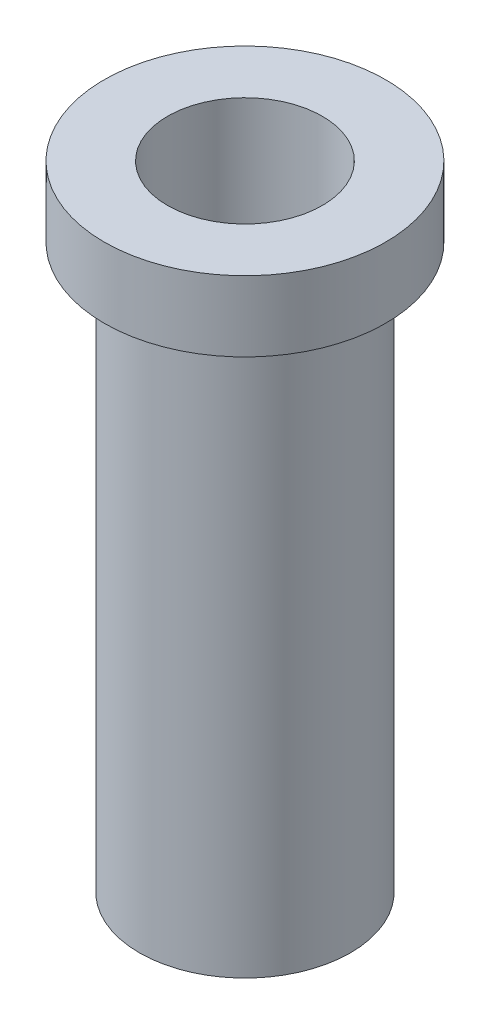
ISO-10303-21;
HEADER;
FILE_DESCRIPTION(('STEP AP214'),'2;1');
FILE_NAME('part.step','',(''),(''),'','','');
FILE_SCHEMA(('AUTOMOTIVE_DESIGN { 1 0 10303 214 1 1 1 1 }'));
ENDSEC;
DATA;
#1=APPLICATION_CONTEXT('core data for automotive mechanical design processes');
#2=APPLICATION_PROTOCOL_DEFINITION('international standard','automotive_design',2000,#1);
#3=PRODUCT_CONTEXT('',#1,'mechanical');
#4=PRODUCT('Part','Part','',(#3));
#5=PRODUCT_RELATED_PRODUCT_CATEGORY('part','',(#4));
#6=PRODUCT_DEFINITION_FORMATION('','',#4);
#7=PRODUCT_DEFINITION_CONTEXT('part definition',#1,'design');
#8=PRODUCT_DEFINITION('design','',#6,#7);
#9=PRODUCT_DEFINITION_SHAPE('','',#8);
#10=(LENGTH_UNIT() NAMED_UNIT(*) SI_UNIT(.MILLI.,.METRE.));
#11=(NAMED_UNIT(*) PLANE_ANGLE_UNIT() SI_UNIT($,.RADIAN.));
#12=(NAMED_UNIT(*) SI_UNIT($,.STERADIAN.) SOLID_ANGLE_UNIT());
#13=UNCERTAINTY_MEASURE_WITH_UNIT(LENGTH_MEASURE(1.E-05),#10,'distance_accuracy_value','');
#14=(GEOMETRIC_REPRESENTATION_CONTEXT(3) GLOBAL_UNCERTAINTY_ASSIGNED_CONTEXT((#13)) GLOBAL_UNIT_ASSIGNED_CONTEXT((#10,
#11,#12)) REPRESENTATION_CONTEXT('',''));
#15=CARTESIAN_POINT('',(0.,0.,0.));
#16=DIRECTION('',(0.,0.,1.));
#17=DIRECTION('',(1.,0.,0.));
#18=AXIS2_PLACEMENT_3D('',#15,#16,#17);
#19=CARTESIAN_POINT('',(0.,-5.,0.));
#20=DIRECTION('',(0.,1.,0.));
#21=DIRECTION('',(0.,0.,1.));
#22=AXIS2_PLACEMENT_3D('',#19,#20,#21);
#23=CYLINDRICAL_SURFACE('',#22,10.);
#24=CARTESIAN_POINT('',(0.,-5.,0.));
#25=DIRECTION('',(0.,1.,0.));
#26=DIRECTION('',(0.,0.,1.));
#27=AXIS2_PLACEMENT_3D('',#24,#25,#26);
#28=CIRCLE('',#27,10.);
#29=CARTESIAN_POINT('',(0.,-5.,10.));
#30=VERTEX_POINT('',#29);
#31=EDGE_CURVE('E37',#30,#30,#28,.T.);
#32=ORIENTED_EDGE('',*,*,#31,.T.);
#33=EDGE_LOOP('',(#32));
#34=FACE_BOUND('',#33,.T.);
#35=CARTESIAN_POINT('',(0.,0.,0.));
#36=DIRECTION('',(0.,1.,0.));
#37=DIRECTION('',(0.,0.,1.));
#38=AXIS2_PLACEMENT_3D('',#35,#36,#37);
#39=CIRCLE('',#38,10.);
#40=CARTESIAN_POINT('',(0.,0.,10.));
#41=VERTEX_POINT('',#40);
#42=EDGE_CURVE('E41',#41,#41,#39,.T.);
#43=ORIENTED_EDGE('',*,*,#42,.F.);
#44=EDGE_LOOP('',(#43));
#45=FACE_BOUND('',#44,.T.);
#46=ADVANCED_FACE('F31',(#34,#45),#23,.T.);
#47=CARTESIAN_POINT('',(0.,-5.,0.));
#48=DIRECTION('',(0.,1.,0.));
#49=DIRECTION('',(0.,0.,1.));
#50=AXIS2_PLACEMENT_3D('',#47,#48,#49);
#51=PLANE('',#50);
#52=CARTESIAN_POINT('',(0.,-5.,0.));
#53=DIRECTION('',(0.,1.,0.));
#54=DIRECTION('',(0.,0.,1.));
#55=AXIS2_PLACEMENT_3D('',#52,#53,#54);
#56=CIRCLE('',#55,7.5);
#57=CARTESIAN_POINT('',(0.,-5.,7.5));
#58=VERTEX_POINT('',#57);
#59=EDGE_CURVE('E10',#58,#58,#56,.F.);
#60=ORIENTED_EDGE('',*,*,#59,.F.);
#61=EDGE_LOOP('',(#60));
#62=FACE_BOUND('',#61,.T.);
#63=ORIENTED_EDGE('',*,*,#31,.F.);
#64=EDGE_LOOP('',(#63));
#65=FACE_BOUND('',#64,.T.);
#66=ADVANCED_FACE('F70',(#62,#65),#51,.F.);
#67=CARTESIAN_POINT('',(0.,0.,0.));
#68=DIRECTION('',(0.,1.,0.));
#69=DIRECTION('',(0.,0.,1.));
#70=AXIS2_PLACEMENT_3D('',#67,#68,#69);
#71=PLANE('',#70);
#72=CARTESIAN_POINT('',(0.,0.,0.));
#73=DIRECTION('',(0.,1.,0.));
#74=DIRECTION('',(0.,0.,1.));
#75=AXIS2_PLACEMENT_3D('',#72,#73,#74);
#76=CIRCLE('',#75,5.5);
#77=CARTESIAN_POINT('',(0.,0.,5.5));
#78=VERTEX_POINT('',#77);
#79=EDGE_CURVE('E51',#78,#78,#76,.T.);
#80=ORIENTED_EDGE('',*,*,#79,.F.);
#81=EDGE_LOOP('',(#80));
#82=FACE_BOUND('',#81,.T.);
#83=ORIENTED_EDGE('',*,*,#42,.T.);
#84=EDGE_LOOP('',(#83));
#85=FACE_BOUND('',#84,.T.);
#86=ADVANCED_FACE('F66',(#82,#85),#71,.T.);
#87=CARTESIAN_POINT('',(0.,-45.,0.));
#88=DIRECTION('',(0.,1.,0.));
#89=DIRECTION('',(0.,0.,1.));
#90=AXIS2_PLACEMENT_3D('',#87,#88,#89);
#91=CYLINDRICAL_SURFACE('',#90,7.5);
#92=CARTESIAN_POINT('',(0.,-45.,0.));
#93=DIRECTION('',(0.,-1.,0.));
#94=DIRECTION('',(0.,0.,-1.));
#95=AXIS2_PLACEMENT_3D('',#92,#93,#94);
#96=CIRCLE('',#95,7.5);
#97=CARTESIAN_POINT('',(0.,-45.,-7.5));
#98=VERTEX_POINT('',#97);
#99=EDGE_CURVE('E46',#98,#98,#96,.T.);
#100=ORIENTED_EDGE('',*,*,#99,.F.);
#101=EDGE_LOOP('',(#100));
#102=FACE_BOUND('',#101,.T.);
#103=ORIENTED_EDGE('',*,*,#59,.T.);
#104=EDGE_LOOP('',(#103));
#105=FACE_BOUND('',#104,.T.);
#106=ADVANCED_FACE('F69',(#102,#105),#91,.T.);
#107=CARTESIAN_POINT('',(0.,-45.,0.));
#108=DIRECTION('',(0.,-1.,0.));
#109=DIRECTION('',(0.,0.,-1.));
#110=AXIS2_PLACEMENT_3D('',#107,#108,#109);
#111=PLANE('',#110);
#112=CARTESIAN_POINT('',(0.,-45.,0.));
#113=DIRECTION('',(0.,1.,0.));
#114=DIRECTION('',(0.,0.,1.));
#115=AXIS2_PLACEMENT_3D('',#112,#113,#114);
#116=CIRCLE('',#115,5.5);
#117=CARTESIAN_POINT('',(0.,-45.,5.5));
#118=VERTEX_POINT('',#117);
#119=EDGE_CURVE('E50',#118,#118,#116,.T.);
#120=ORIENTED_EDGE('',*,*,#119,.T.);
#121=EDGE_LOOP('',(#120));
#122=FACE_BOUND('',#121,.T.);
#123=ORIENTED_EDGE('',*,*,#99,.T.);
#124=EDGE_LOOP('',(#123));
#125=FACE_BOUND('',#124,.T.);
#126=ADVANCED_FACE('F57',(#122,#125),#111,.T.);
#127=CARTESIAN_POINT('',(0.,-45.,0.));
#128=DIRECTION('',(0.,1.,0.));
#129=DIRECTION('',(0.,0.,1.));
#130=AXIS2_PLACEMENT_3D('',#127,#128,#129);
#131=CYLINDRICAL_SURFACE('',#130,5.5);
#132=CARTESIAN_POINT('',(0.,-45.,5.5));
#133=CARTESIAN_POINT('',(0.,-44.53125,5.5));
#134=CARTESIAN_POINT('',(0.,-44.0625,5.5));
#135=CARTESIAN_POINT('',(0.,-43.125,5.5));
#136=CARTESIAN_POINT('',(0.,-42.65625,5.5));
#137=CARTESIAN_POINT('',(0.,-41.71875,5.5));
#138=CARTESIAN_POINT('',(0.,-41.25,5.5));
#139=CARTESIAN_POINT('',(0.,-40.3125,5.5));
#140=CARTESIAN_POINT('',(0.,-39.84375,5.5));
#141=CARTESIAN_POINT('',(0.,-38.90625,5.5));
#142=CARTESIAN_POINT('',(0.,-38.4375,5.5));
#143=CARTESIAN_POINT('',(0.,-37.5,5.5));
#144=CARTESIAN_POINT('',(0.,-37.03125,5.5));
#145=CARTESIAN_POINT('',(0.,-36.09375,5.5));
#146=CARTESIAN_POINT('',(0.,-35.625,5.5));
#147=CARTESIAN_POINT('',(0.,-34.6875,5.5));
#148=CARTESIAN_POINT('',(0.,-34.21875,5.5));
#149=CARTESIAN_POINT('',(0.,-33.28125,5.5));
#150=CARTESIAN_POINT('',(0.,-32.8125,5.5));
#151=CARTESIAN_POINT('',(0.,-31.875,5.5));
#152=CARTESIAN_POINT('',(0.,-31.40625,5.5));
#153=CARTESIAN_POINT('',(0.,-30.46875,5.5));
#154=CARTESIAN_POINT('',(0.,-30.,5.5));
#155=CARTESIAN_POINT('',(0.,-29.0625,5.5));
#156=CARTESIAN_POINT('',(0.,-28.59375,5.5));
#157=CARTESIAN_POINT('',(0.,-27.65625,5.5));
#158=CARTESIAN_POINT('',(0.,-27.1875,5.5));
#159=CARTESIAN_POINT('',(0.,-26.25,5.5));
#160=CARTESIAN_POINT('',(0.,-25.78125,5.5));
#161=CARTESIAN_POINT('',(0.,-24.84375,5.5));
#162=CARTESIAN_POINT('',(0.,-24.375,5.5));
#163=CARTESIAN_POINT('',(0.,-23.4375,5.5));
#164=CARTESIAN_POINT('',(0.,-22.96875,5.5));
#165=CARTESIAN_POINT('',(0.,-22.03125,5.5));
#166=CARTESIAN_POINT('',(0.,-21.5625,5.5));
#167=CARTESIAN_POINT('',(0.,-20.625,5.5));
#168=CARTESIAN_POINT('',(0.,-20.15625,5.5));
#169=CARTESIAN_POINT('',(0.,-19.21875,5.5));
#170=CARTESIAN_POINT('',(0.,-18.75,5.5));
#171=CARTESIAN_POINT('',(0.,-17.8125,5.5));
#172=CARTESIAN_POINT('',(0.,-17.34375,5.5));
#173=CARTESIAN_POINT('',(0.,-16.40625,5.5));
#174=CARTESIAN_POINT('',(0.,-15.9375,5.5));
#175=CARTESIAN_POINT('',(0.,-15.,5.5));
#176=CARTESIAN_POINT('',(0.,-14.53125,5.5));
#177=CARTESIAN_POINT('',(0.,-13.59375,5.5));
#178=CARTESIAN_POINT('',(0.,-13.125,5.5));
#179=CARTESIAN_POINT('',(0.,-12.1875,5.5));
#180=CARTESIAN_POINT('',(0.,-11.71875,5.5));
#181=CARTESIAN_POINT('',(0.,-10.78125,5.5));
#182=CARTESIAN_POINT('',(0.,-10.3125,5.5));
#183=CARTESIAN_POINT('',(0.,-9.37500000000001,5.5));
#184=CARTESIAN_POINT('',(0.,-8.90625000000001,5.5));
#185=CARTESIAN_POINT('',(0.,-7.96875000000001,5.5));
#186=CARTESIAN_POINT('',(0.,-7.50000000000001,5.5));
#187=CARTESIAN_POINT('',(0.,-6.56250000000001,5.5));
#188=CARTESIAN_POINT('',(0.,-6.09375000000001,5.5));
#189=CARTESIAN_POINT('',(0.,-5.15625000000001,5.5));
#190=CARTESIAN_POINT('',(0.,-4.68750000000001,5.5));
#191=CARTESIAN_POINT('',(0.,-3.75000000000001,5.5));
#192=CARTESIAN_POINT('',(0.,-3.28125000000001,5.5));
#193=CARTESIAN_POINT('',(0.,-2.34375000000001,5.5));
#194=CARTESIAN_POINT('',(0.,-1.87500000000001,5.5));
#195=CARTESIAN_POINT('',(0.,-0.937500000000006,5.5));
#196=CARTESIAN_POINT('',(0.,-0.468750000000007,5.5));
#197=CARTESIAN_POINT('',(0.,0.,5.5));
#198=B_SPLINE_CURVE_WITH_KNOTS('',3,(#132,#133,#134,#135,#136,#137,#138,#139,#140,#141,#142,
#143,#144,#145,#146,#147,#148,#149,#150,#151,#152,#153,#154,#155,#156,#157,#158,#159,#160,#161,
#162,#163,#164,#165,#166,#167,#168,#169,#170,#171,#172,#173,#174,#175,#176,#177,#178,#179,#180,
#181,#182,#183,#184,#185,#186,#187,#188,#189,#190,#191,#192,#193,#194,#195,#196,#197),
.UNSPECIFIED.,.F.,.F.,(4,2,2,2,2,2,2,2,2,2,2,2,2,2,2,2,2,2,2,2,2,2,2,2,2,2,2,2,2,2,2,2,4),(0.,
1.40625,2.8125,4.21875,5.62500000000001,7.03125,8.4375,9.84375000000001,11.25,12.65625,14.0625,
15.46875,16.875,18.28125,19.6875,21.09375,22.5,23.90625,25.3125,26.71875,28.125,29.53125,
30.9375,32.34375,33.75,35.15625,36.5625,37.96875,39.375,40.78125,42.1875,43.59375,45.),.UNSPECIFIED.);
#199=EDGE_CURVE('BSEAM60',#118,#78,#198,.T.);
#200=ORIENTED_EDGE('',*,*,#119,.F.);
#201=ORIENTED_EDGE('',*,*,#79,.T.);
#202=ORIENTED_EDGE('',*,*,#199,.T.);
#203=ORIENTED_EDGE('',*,*,#199,.F.);
#204=EDGE_LOOP('',(#200,#202,#201,#203));
#205=FACE_BOUND('',#204,.T.);
#206=ADVANCED_FACE('F60',(#205),#131,.F.);
#207=CLOSED_SHELL('',(#46,#66,#86,#106,#126,#206));
#208=MANIFOLD_SOLID_BREP('B2',#207);
#209=ADVANCED_BREP_SHAPE_REPRESENTATION('',(#18,#208),#14);
#210=SHAPE_DEFINITION_REPRESENTATION(#9,#209);
ENDSEC;
END-ISO-10303-21;
